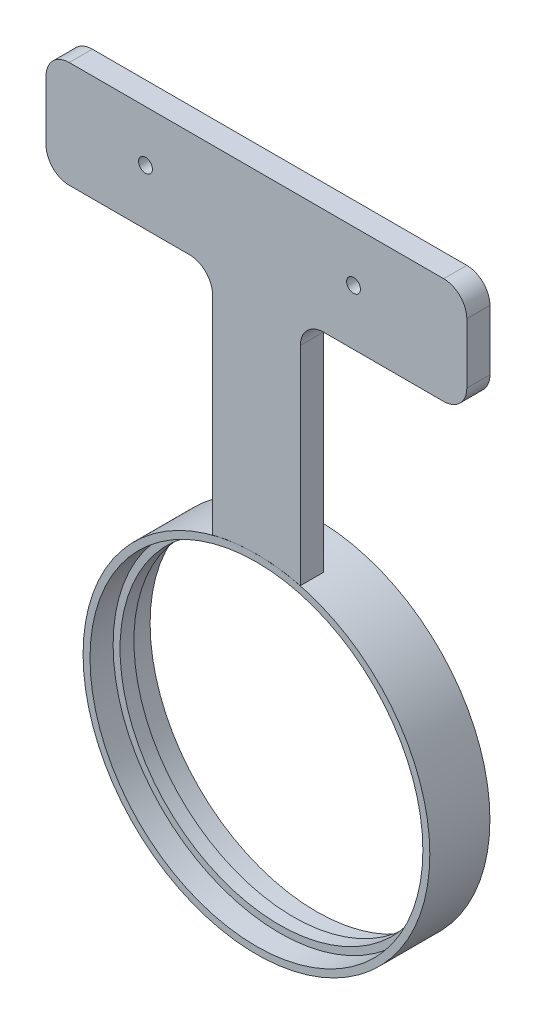
ISO-10303-21;
HEADER;
FILE_DESCRIPTION(('STEP AP214'),'2;1');
FILE_NAME('part.step','',(''),(''),'','','');
FILE_SCHEMA(('AUTOMOTIVE_DESIGN { 1 0 10303 214 1 1 1 1 }'));
ENDSEC;
DATA;
#1=APPLICATION_CONTEXT('core data for automotive mechanical design processes');
#2=APPLICATION_PROTOCOL_DEFINITION('international standard','automotive_design',2000,#1);
#3=PRODUCT_CONTEXT('',#1,'mechanical');
#4=PRODUCT('Part','Part','',(#3));
#5=PRODUCT_RELATED_PRODUCT_CATEGORY('part','',(#4));
#6=PRODUCT_DEFINITION_FORMATION('','',#4);
#7=PRODUCT_DEFINITION_CONTEXT('part definition',#1,'design');
#8=PRODUCT_DEFINITION('design','',#6,#7);
#9=PRODUCT_DEFINITION_SHAPE('','',#8);
#10=(LENGTH_UNIT() NAMED_UNIT(*) SI_UNIT(.MILLI.,.METRE.));
#11=(NAMED_UNIT(*) PLANE_ANGLE_UNIT() SI_UNIT($,.RADIAN.));
#12=(NAMED_UNIT(*) SI_UNIT($,.STERADIAN.) SOLID_ANGLE_UNIT());
#13=UNCERTAINTY_MEASURE_WITH_UNIT(LENGTH_MEASURE(1.E-05),#10,'distance_accuracy_value','');
#14=(GEOMETRIC_REPRESENTATION_CONTEXT(3) GLOBAL_UNCERTAINTY_ASSIGNED_CONTEXT((#13)) GLOBAL_UNIT_ASSIGNED_CONTEXT((#10,
#11,#12)) REPRESENTATION_CONTEXT('',''));
#15=CARTESIAN_POINT('',(0.,0.,0.));
#16=DIRECTION('',(0.,0.,1.));
#17=DIRECTION('',(1.,0.,0.));
#18=AXIS2_PLACEMENT_3D('',#15,#16,#17);
#19=CARTESIAN_POINT('',(45.5,-36.3153777322306,-8.));
#20=DIRECTION('',(0.,0.,1.));
#21=DIRECTION('',(1.,0.,0.));
#22=AXIS2_PLACEMENT_3D('',#19,#20,#21);
#23=CYLINDRICAL_SURFACE('',#22,37.5);
#24=CARTESIAN_POINT('',(45.5,-36.3153777322306,-8.));
#25=DIRECTION('',(0.,0.,1.));
#26=DIRECTION('',(1.,0.,0.));
#27=AXIS2_PLACEMENT_3D('',#24,#25,#26);
#28=CIRCLE('',#27,37.5);
#29=CARTESIAN_POINT('',(83.,-36.3153777322306,-8.));
#30=VERTEX_POINT('',#29);
#31=EDGE_CURVE('E11',#30,#30,#28,.T.);
#32=CARTESIAN_POINT('',(45.5,-36.3153777322306,5.));
#33=DIRECTION('',(0.,0.,1.));
#34=DIRECTION('',(1.,0.,0.));
#35=AXIS2_PLACEMENT_3D('',#32,#33,#34);
#36=CIRCLE('',#35,37.5);
#37=CARTESIAN_POINT('',(83.,-36.3153777322306,5.));
#38=VERTEX_POINT('',#37);
#39=EDGE_CURVE('E60',#38,#38,#36,.T.);
#40=CARTESIAN_POINT('',(83.,-36.3153777322306,-8.));
#41=CARTESIAN_POINT('',(83.,-36.3153777322306,-7.86458333333333));
#42=CARTESIAN_POINT('',(83.,-36.3153777322306,-7.72916666666667));
#43=CARTESIAN_POINT('',(83.,-36.3153777322306,-7.45833333333333));
#44=CARTESIAN_POINT('',(83.,-36.3153777322306,-7.32291666666667));
#45=CARTESIAN_POINT('',(83.,-36.3153777322306,-7.05208333333333));
#46=CARTESIAN_POINT('',(83.,-36.3153777322306,-6.91666666666667));
#47=CARTESIAN_POINT('',(83.,-36.3153777322306,-6.64583333333333));
#48=CARTESIAN_POINT('',(83.,-36.3153777322306,-6.51041666666667));
#49=CARTESIAN_POINT('',(83.,-36.3153777322306,-6.23958333333333));
#50=CARTESIAN_POINT('',(83.,-36.3153777322306,-6.10416666666667));
#51=CARTESIAN_POINT('',(83.,-36.3153777322306,-5.83333333333334));
#52=CARTESIAN_POINT('',(83.,-36.3153777322306,-5.69791666666667));
#53=CARTESIAN_POINT('',(83.,-36.3153777322306,-5.42708333333333));
#54=CARTESIAN_POINT('',(83.,-36.3153777322306,-5.29166666666667));
#55=CARTESIAN_POINT('',(83.,-36.3153777322306,-5.02083333333333));
#56=CARTESIAN_POINT('',(83.,-36.3153777322306,-4.88541666666667));
#57=CARTESIAN_POINT('',(83.,-36.3153777322306,-4.61458333333333));
#58=CARTESIAN_POINT('',(83.,-36.3153777322306,-4.47916666666667));
#59=CARTESIAN_POINT('',(83.,-36.3153777322306,-4.20833333333333));
#60=CARTESIAN_POINT('',(83.,-36.3153777322306,-4.07291666666667));
#61=CARTESIAN_POINT('',(83.,-36.3153777322306,-3.80208333333333));
#62=CARTESIAN_POINT('',(83.,-36.3153777322306,-3.66666666666667));
#63=CARTESIAN_POINT('',(83.,-36.3153777322306,-3.39583333333333));
#64=CARTESIAN_POINT('',(83.,-36.3153777322306,-3.26041666666667));
#65=CARTESIAN_POINT('',(83.,-36.3153777322306,-2.98958333333333));
#66=CARTESIAN_POINT('',(83.,-36.3153777322306,-2.85416666666667));
#67=CARTESIAN_POINT('',(83.,-36.3153777322306,-2.58333333333333));
#68=CARTESIAN_POINT('',(83.,-36.3153777322306,-2.44791666666667));
#69=CARTESIAN_POINT('',(83.,-36.3153777322306,-2.17708333333333));
#70=CARTESIAN_POINT('',(83.,-36.3153777322306,-2.04166666666667));
#71=CARTESIAN_POINT('',(83.,-36.3153777322306,-1.77083333333333));
#72=CARTESIAN_POINT('',(83.,-36.3153777322306,-1.63541666666667));
#73=CARTESIAN_POINT('',(83.,-36.3153777322306,-1.36458333333333));
#74=CARTESIAN_POINT('',(83.,-36.3153777322306,-1.22916666666667));
#75=CARTESIAN_POINT('',(83.,-36.3153777322306,-0.958333333333334));
#76=CARTESIAN_POINT('',(83.,-36.3153777322306,-0.822916666666668));
#77=CARTESIAN_POINT('',(83.,-36.3153777322306,-0.552083333333335));
#78=CARTESIAN_POINT('',(83.,-36.3153777322306,-0.416666666666668));
#79=CARTESIAN_POINT('',(83.,-36.3153777322306,-0.145833333333335));
#80=CARTESIAN_POINT('',(83.,-36.3153777322306,-0.0104166666666681));
#81=CARTESIAN_POINT('',(83.,-36.3153777322306,0.260416666666665));
#82=CARTESIAN_POINT('',(83.,-36.3153777322306,0.395833333333332));
#83=CARTESIAN_POINT('',(83.,-36.3153777322306,0.666666666666665));
#84=CARTESIAN_POINT('',(83.,-36.3153777322306,0.802083333333332));
#85=CARTESIAN_POINT('',(83.,-36.3153777322306,1.07291666666667));
#86=CARTESIAN_POINT('',(83.,-36.3153777322306,1.20833333333333));
#87=CARTESIAN_POINT('',(83.,-36.3153777322306,1.47916666666667));
#88=CARTESIAN_POINT('',(83.,-36.3153777322306,1.61458333333333));
#89=CARTESIAN_POINT('',(83.,-36.3153777322306,1.88541666666667));
#90=CARTESIAN_POINT('',(83.,-36.3153777322306,2.02083333333333));
#91=CARTESIAN_POINT('',(83.,-36.3153777322306,2.29166666666667));
#92=CARTESIAN_POINT('',(83.,-36.3153777322306,2.42708333333333));
#93=CARTESIAN_POINT('',(83.,-36.3153777322306,2.69791666666667));
#94=CARTESIAN_POINT('',(83.,-36.3153777322306,2.83333333333333));
#95=CARTESIAN_POINT('',(83.,-36.3153777322306,3.10416666666667));
#96=CARTESIAN_POINT('',(83.,-36.3153777322306,3.23958333333333));
#97=CARTESIAN_POINT('',(83.,-36.3153777322306,3.51041666666667));
#98=CARTESIAN_POINT('',(83.,-36.3153777322306,3.64583333333333));
#99=CARTESIAN_POINT('',(83.,-36.3153777322306,3.91666666666667));
#100=CARTESIAN_POINT('',(83.,-36.3153777322306,4.05208333333333));
#101=CARTESIAN_POINT('',(83.,-36.3153777322306,4.32291666666667));
#102=CARTESIAN_POINT('',(83.,-36.3153777322306,4.45833333333333));
#103=CARTESIAN_POINT('',(83.,-36.3153777322306,4.72916666666667));
#104=CARTESIAN_POINT('',(83.,-36.3153777322306,4.86458333333333));
#105=CARTESIAN_POINT('',(83.,-36.3153777322306,5.));
#106=B_SPLINE_CURVE_WITH_KNOTS('',3,(#40,#41,#42,#43,#44,#45,#46,#47,#48,#49,#50,#51,#52,#53,
#54,#55,#56,#57,#58,#59,#60,#61,#62,#63,#64,#65,#66,#67,#68,#69,#70,#71,#72,#73,#74,#75,#76,#77,
#78,#79,#80,#81,#82,#83,#84,#85,#86,#87,#88,#89,#90,#91,#92,#93,#94,#95,#96,#97,#98,#99,#100,
#101,#102,#103,#104,#105),.UNSPECIFIED.,.F.,.F.,(4,2,2,2,2,2,2,2,2,2,2,2,2,2,2,2,2,2,2,2,2,2,2,
2,2,2,2,2,2,2,2,2,4),(0.,0.40625,0.812499999999999,1.21875,1.625,2.03125,2.4375,2.84375,3.25,
3.65625,4.0625,4.46875,4.875,5.28125,5.6875,6.09375,6.5,6.90625,7.3125,7.71875,8.125,8.53125,
8.9375,9.34375,9.75,10.15625,10.5625,10.96875,11.375,11.78125,12.1875,12.59375,13.),.UNSPECIFIED.);
#107=EDGE_CURVE('BSEAM53',#30,#38,#106,.T.);
#108=ORIENTED_EDGE('',*,*,#31,.T.);
#109=ORIENTED_EDGE('',*,*,#39,.F.);
#110=ORIENTED_EDGE('',*,*,#107,.T.);
#111=ORIENTED_EDGE('',*,*,#107,.F.);
#112=EDGE_LOOP('',(#108,#110,#109,#111));
#113=FACE_BOUND('',#112,.T.);
#114=ADVANCED_FACE('F53',(#113),#23,.T.);
#115=CARTESIAN_POINT('',(45.5,-36.3153777322306,-8.));
#116=DIRECTION('',(0.,0.,1.));
#117=DIRECTION('',(1.,0.,0.));
#118=AXIS2_PLACEMENT_3D('',#115,#116,#117);
#119=PLANE('',#118);
#120=CARTESIAN_POINT('',(45.5,-36.3153777322306,-8.));
#121=DIRECTION('',(0.,0.,1.));
#122=DIRECTION('',(1.,0.,0.));
#123=AXIS2_PLACEMENT_3D('',#120,#121,#122);
#124=CIRCLE('',#123,36.);
#125=CARTESIAN_POINT('',(81.5,-36.3153777322306,-8.));
#126=VERTEX_POINT('',#125);
#127=EDGE_CURVE('E70',#126,#126,#124,.T.);
#128=ORIENTED_EDGE('',*,*,#127,.T.);
#129=EDGE_LOOP('',(#128));
#130=FACE_BOUND('',#129,.T.);
#131=ORIENTED_EDGE('',*,*,#31,.F.);
#132=EDGE_LOOP('',(#131));
#133=FACE_BOUND('',#132,.T.);
#134=ADVANCED_FACE('F97',(#130,#133),#119,.F.);
#135=CARTESIAN_POINT('',(45.5,-36.3153777322306,5.));
#136=DIRECTION('',(0.,0.,1.));
#137=DIRECTION('',(1.,0.,0.));
#138=AXIS2_PLACEMENT_3D('',#135,#136,#137);
#139=PLANE('',#138);
#140=CARTESIAN_POINT('',(45.5,-36.3153777322306,5.));
#141=DIRECTION('',(0.,0.,1.));
#142=DIRECTION('',(1.,0.,0.));
#143=AXIS2_PLACEMENT_3D('',#140,#141,#142);
#144=CIRCLE('',#143,36.);
#145=CARTESIAN_POINT('',(81.5,-36.3153777322306,5.));
#146=VERTEX_POINT('',#145);
#147=EDGE_CURVE('E67',#146,#146,#144,.T.);
#148=ORIENTED_EDGE('',*,*,#147,.F.);
#149=EDGE_LOOP('',(#148));
#150=FACE_BOUND('',#149,.T.);
#151=ORIENTED_EDGE('',*,*,#39,.T.);
#152=EDGE_LOOP('',(#151));
#153=FACE_BOUND('',#152,.T.);
#154=ADVANCED_FACE('F101',(#150,#153),#139,.T.);
#155=CARTESIAN_POINT('',(45.5,-36.3153777322306,0.));
#156=DIRECTION('',(0.,0.,1.));
#157=DIRECTION('',(1.,0.,0.));
#158=AXIS2_PLACEMENT_3D('',#155,#156,#157);
#159=CYLINDRICAL_SURFACE('',#158,36.);
#160=CARTESIAN_POINT('',(45.5,-36.3153777322306,0.));
#161=DIRECTION('',(0.,0.,1.));
#162=DIRECTION('',(1.,0.,0.));
#163=AXIS2_PLACEMENT_3D('',#160,#161,#162);
#164=CIRCLE('',#163,36.);
#165=CARTESIAN_POINT('',(81.5,-36.3153777322306,0.));
#166=VERTEX_POINT('',#165);
#167=EDGE_CURVE('E65',#166,#166,#164,.T.);
#168=ORIENTED_EDGE('',*,*,#167,.F.);
#169=EDGE_LOOP('',(#168));
#170=FACE_BOUND('',#169,.T.);
#171=ORIENTED_EDGE('',*,*,#147,.T.);
#172=EDGE_LOOP('',(#171));
#173=FACE_BOUND('',#172,.T.);
#174=ADVANCED_FACE('F108',(#170,#173),#159,.F.);
#175=CARTESIAN_POINT('',(45.5,-36.3153777322306,0.));
#176=DIRECTION('',(0.,0.,1.));
#177=DIRECTION('',(1.,0.,0.));
#178=AXIS2_PLACEMENT_3D('',#175,#176,#177);
#179=PLANE('',#178);
#180=CARTESIAN_POINT('',(45.5,-36.3153777322306,0.));
#181=DIRECTION('',(0.,0.,1.));
#182=DIRECTION('',(1.,0.,0.));
#183=AXIS2_PLACEMENT_3D('',#180,#181,#182);
#184=CIRCLE('',#183,34.5);
#185=CARTESIAN_POINT('',(80.,-36.3153777322306,0.));
#186=VERTEX_POINT('',#185);
#187=EDGE_CURVE('E78',#186,#186,#184,.T.);
#188=ORIENTED_EDGE('',*,*,#187,.F.);
#189=EDGE_LOOP('',(#188));
#190=FACE_BOUND('',#189,.T.);
#191=ORIENTED_EDGE('',*,*,#167,.T.);
#192=EDGE_LOOP('',(#191));
#193=FACE_BOUND('',#192,.T.);
#194=ADVANCED_FACE('F113',(#190,#193),#179,.T.);
#195=CARTESIAN_POINT('',(45.5,-36.3153777322306,-8.));
#196=DIRECTION('',(0.,0.,1.));
#197=DIRECTION('',(1.,0.,0.));
#198=AXIS2_PLACEMENT_3D('',#195,#196,#197);
#199=CYLINDRICAL_SURFACE('',#198,36.);
#200=ORIENTED_EDGE('',*,*,#127,.F.);
#201=EDGE_LOOP('',(#200));
#202=FACE_BOUND('',#201,.T.);
#203=CARTESIAN_POINT('',(45.5,-36.3153777322306,-3.));
#204=DIRECTION('',(0.,0.,1.));
#205=DIRECTION('',(1.,0.,0.));
#206=AXIS2_PLACEMENT_3D('',#203,#204,#205);
#207=CIRCLE('',#206,36.);
#208=CARTESIAN_POINT('',(81.5,-36.3153777322306,-3.));
#209=VERTEX_POINT('',#208);
#210=EDGE_CURVE('E73',#209,#209,#207,.T.);
#211=ORIENTED_EDGE('',*,*,#210,.T.);
#212=EDGE_LOOP('',(#211));
#213=FACE_BOUND('',#212,.T.);
#214=ADVANCED_FACE('F94',(#202,#213),#199,.F.);
#215=CARTESIAN_POINT('',(45.5,-36.3153777322306,-3.));
#216=DIRECTION('',(0.,0.,1.));
#217=DIRECTION('',(1.,0.,0.));
#218=AXIS2_PLACEMENT_3D('',#215,#216,#217);
#219=PLANE('',#218);
#220=CARTESIAN_POINT('',(45.5,-36.3153777322306,-3.));
#221=DIRECTION('',(0.,0.,1.));
#222=DIRECTION('',(1.,0.,0.));
#223=AXIS2_PLACEMENT_3D('',#220,#221,#222);
#224=CIRCLE('',#223,34.5);
#225=CARTESIAN_POINT('',(80.,-36.3153777322306,-3.));
#226=VERTEX_POINT('',#225);
#227=EDGE_CURVE('E56',#226,#226,#224,.T.);
#228=ORIENTED_EDGE('',*,*,#227,.T.);
#229=EDGE_LOOP('',(#228));
#230=FACE_BOUND('',#229,.T.);
#231=ORIENTED_EDGE('',*,*,#210,.F.);
#232=EDGE_LOOP('',(#231));
#233=FACE_BOUND('',#232,.T.);
#234=ADVANCED_FACE('F85',(#230,#233),#219,.F.);
#235=CARTESIAN_POINT('',(45.5,-36.3153777322306,-5.));
#236=DIRECTION('',(0.,0.,1.));
#237=DIRECTION('',(1.,0.,0.));
#238=AXIS2_PLACEMENT_3D('',#235,#236,#237);
#239=CYLINDRICAL_SURFACE('',#238,34.5);
#240=ORIENTED_EDGE('',*,*,#187,.T.);
#241=EDGE_LOOP('',(#240));
#242=FACE_BOUND('',#241,.T.);
#243=ORIENTED_EDGE('',*,*,#227,.F.);
#244=EDGE_LOOP('',(#243));
#245=FACE_BOUND('',#244,.T.);
#246=ADVANCED_FACE('F88',(#242,#245),#239,.F.);
#247=CLOSED_SHELL('',(#114,#134,#154,#174,#194,#214,#234,#246));
#248=MANIFOLD_SOLID_BREP('B2',#247);
#249=CARTESIAN_POINT('',(86.,68.,5.));
#250=DIRECTION('',(0.,0.,1.));
#251=DIRECTION('',(1.,0.,0.));
#252=AXIS2_PLACEMENT_3D('',#249,#250,#251);
#253=CYLINDRICAL_SURFACE('',#252,5.);
#254=DIRECTION('',(0.,0.,1.));
#255=VECTOR('',#254,1.);
#256=CARTESIAN_POINT('',(91.,68.,5.));
#257=LINE('',#256,#255);
#258=CARTESIAN_POINT('',(91.,68.,0.));
#259=VERTEX_POINT('',#258);
#260=CARTESIAN_POINT('',(91.,68.,5.));
#261=VERTEX_POINT('',#260);
#262=EDGE_CURVE('E454',#259,#261,#257,.T.);
#263=ORIENTED_EDGE('',*,*,#262,.F.);
#264=CARTESIAN_POINT('',(86.,68.,0.));
#265=DIRECTION('',(0.,0.,-1.));
#266=DIRECTION('',(-1.,0.,0.));
#267=AXIS2_PLACEMENT_3D('',#264,#265,#266);
#268=CIRCLE('',#267,5.);
#269=CARTESIAN_POINT('',(86.,73.,0.));
#270=VERTEX_POINT('',#269);
#271=EDGE_CURVE('E215',#270,#259,#268,.T.);
#272=ORIENTED_EDGE('',*,*,#271,.F.);
#273=DIRECTION('',(0.,0.,1.));
#274=VECTOR('',#273,1.);
#275=CARTESIAN_POINT('',(86.,73.,5.));
#276=LINE('',#275,#274);
#277=CARTESIAN_POINT('',(86.,73.,5.));
#278=VERTEX_POINT('',#277);
#279=EDGE_CURVE('E310',#278,#270,#276,.F.);
#280=ORIENTED_EDGE('',*,*,#279,.F.);
#281=CARTESIAN_POINT('',(86.,68.,5.));
#282=DIRECTION('',(0.,0.,-1.));
#283=DIRECTION('',(-1.,0.,0.));
#284=AXIS2_PLACEMENT_3D('',#281,#282,#283);
#285=CIRCLE('',#284,5.);
#286=EDGE_CURVE('E51',#261,#278,#285,.F.);
#287=ORIENTED_EDGE('',*,*,#286,.F.);
#288=EDGE_LOOP('',(#263,#272,#280,#287));
#289=FACE_BOUND('',#288,.T.);
#290=ADVANCED_FACE('F207',(#289),#253,.T.);
#291=CARTESIAN_POINT('',(0.,0.,5.));
#292=DIRECTION('',(1.,0.,0.));
#293=DIRECTION('',(0.,0.,-1.));
#294=AXIS2_PLACEMENT_3D('',#291,#292,#293);
#295=PLANE('',#294);
#296=DIRECTION('',(0.,0.,1.));
#297=VECTOR('',#296,1.);
#298=CARTESIAN_POINT('',(0.,68.,0.));
#299=LINE('',#298,#297);
#300=CARTESIAN_POINT('',(0.,68.,0.));
#301=VERTEX_POINT('',#300);
#302=CARTESIAN_POINT('',(0.,68.,5.));
#303=VERTEX_POINT('',#302);
#304=EDGE_CURVE('E325',#301,#303,#299,.T.);
#305=ORIENTED_EDGE('',*,*,#304,.F.);
#306=DIRECTION('',(0.,-1.,0.));
#307=VECTOR('',#306,1.);
#308=CARTESIAN_POINT('',(0.,0.,0.));
#309=LINE('',#308,#307);
#310=CARTESIAN_POINT('',(0.,55.,0.));
#311=VERTEX_POINT('',#310);
#312=EDGE_CURVE('E330',#301,#311,#309,.T.);
#313=ORIENTED_EDGE('',*,*,#312,.T.);
#314=DIRECTION('',(0.,0.,1.));
#315=VECTOR('',#314,1.);
#316=CARTESIAN_POINT('',(0.,55.,-5.));
#317=LINE('',#316,#315);
#318=CARTESIAN_POINT('',(0.,55.,5.));
#319=VERTEX_POINT('',#318);
#320=EDGE_CURVE('E366',#311,#319,#317,.T.);
#321=ORIENTED_EDGE('',*,*,#320,.T.);
#322=DIRECTION('',(0.,-1.,0.));
#323=VECTOR('',#322,1.);
#324=CARTESIAN_POINT('',(0.,0.,5.));
#325=LINE('',#324,#323);
#326=EDGE_CURVE('E314',#303,#319,#325,.T.);
#327=ORIENTED_EDGE('',*,*,#326,.F.);
#328=EDGE_LOOP('',(#305,#313,#321,#327));
#329=FACE_BOUND('',#328,.T.);
#330=ADVANCED_FACE('F507',(#329),#295,.F.);
#331=CARTESIAN_POINT('',(0.,0.,5.));
#332=DIRECTION('',(0.,0.,-1.));
#333=DIRECTION('',(-1.,0.,0.));
#334=AXIS2_PLACEMENT_3D('',#331,#332,#333);
#335=PLANE('',#334);
#336=CARTESIAN_POINT('',(21.5,62.,5.));
#337=DIRECTION('',(0.,0.,1.));
#338=DIRECTION('',(1.,0.,0.));
#339=AXIS2_PLACEMENT_3D('',#336,#337,#338);
#340=CIRCLE('',#339,1.5);
#341=CARTESIAN_POINT('',(23.,62.,5.));
#342=VERTEX_POINT('',#341);
#343=EDGE_CURVE('E557',#342,#342,#340,.T.);
#344=ORIENTED_EDGE('',*,*,#343,.F.);
#345=EDGE_LOOP('',(#344));
#346=FACE_BOUND('',#345,.T.);
#347=CARTESIAN_POINT('',(66.5,62.,5.));
#348=DIRECTION('',(0.,0.,1.));
#349=DIRECTION('',(1.,0.,0.));
#350=AXIS2_PLACEMENT_3D('',#347,#348,#349);
#351=CIRCLE('',#350,1.5);
#352=CARTESIAN_POINT('',(68.,62.,5.));
#353=VERTEX_POINT('',#352);
#354=EDGE_CURVE('E559',#353,#353,#351,.T.);
#355=ORIENTED_EDGE('',*,*,#354,.F.);
#356=EDGE_LOOP('',(#355));
#357=FACE_BOUND('',#356,.T.);
#358=DIRECTION('',(0.,1.,0.));
#359=VECTOR('',#358,1.);
#360=CARTESIAN_POINT('',(91.,0.,5.));
#361=LINE('',#360,#359);
#362=CARTESIAN_POINT('',(91.,55.,5.));
#363=VERTEX_POINT('',#362);
#364=EDGE_CURVE('E414',#363,#261,#361,.T.);
#365=ORIENTED_EDGE('',*,*,#364,.T.);
#366=ORIENTED_EDGE('',*,*,#286,.T.);
#367=DIRECTION('',(-1.,0.,0.));
#368=VECTOR('',#367,1.);
#369=CARTESIAN_POINT('',(0.,73.,5.));
#370=LINE('',#369,#368);
#371=CARTESIAN_POINT('',(5.00000000000004,73.,5.));
#372=VERTEX_POINT('',#371);
#373=EDGE_CURVE('E417',#278,#372,#370,.T.);
#374=ORIENTED_EDGE('',*,*,#373,.T.);
#375=CARTESIAN_POINT('',(5.,68.,5.));
#376=DIRECTION('',(0.,0.,1.));
#377=DIRECTION('',(1.,0.,0.));
#378=AXIS2_PLACEMENT_3D('',#375,#376,#377);
#379=CIRCLE('',#378,5.);
#380=EDGE_CURVE('E323',#372,#303,#379,.T.);
#381=ORIENTED_EDGE('',*,*,#380,.T.);
#382=ORIENTED_EDGE('',*,*,#326,.T.);
#383=CARTESIAN_POINT('',(5.,55.,5.));
#384=DIRECTION('',(0.,0.,-1.));
#385=DIRECTION('',(-1.,0.,0.));
#386=AXIS2_PLACEMENT_3D('',#383,#384,#385);
#387=CIRCLE('',#386,5.);
#388=CARTESIAN_POINT('',(5.00000000000004,50.,5.));
#389=VERTEX_POINT('',#388);
#390=EDGE_CURVE('E349',#389,#319,#387,.T.);
#391=ORIENTED_EDGE('',*,*,#390,.F.);
#392=DIRECTION('',(1.,0.,0.));
#393=VECTOR('',#392,1.);
#394=CARTESIAN_POINT('',(5.00000000000004,50.,5.));
#395=LINE('',#394,#393);
#396=CARTESIAN_POINT('',(31.,50.,5.));
#397=VERTEX_POINT('',#396);
#398=EDGE_CURVE('E362',#389,#397,#395,.T.);
#399=ORIENTED_EDGE('',*,*,#398,.T.);
#400=CARTESIAN_POINT('',(31.,45.,5.));
#401=DIRECTION('',(0.,0.,-1.));
#402=DIRECTION('',(-1.,0.,0.));
#403=AXIS2_PLACEMENT_3D('',#400,#401,#402);
#404=CIRCLE('',#403,5.);
#405=CARTESIAN_POINT('',(36.,45.,5.));
#406=VERTEX_POINT('',#405);
#407=EDGE_CURVE('E358',#397,#406,#404,.T.);
#408=ORIENTED_EDGE('',*,*,#407,.T.);
#409=DIRECTION('',(0.,1.,0.));
#410=VECTOR('',#409,1.);
#411=CARTESIAN_POINT('',(36.,0.,5.));
#412=LINE('',#411,#410);
#413=CARTESIAN_POINT('',(36.,0.,5.));
#414=VERTEX_POINT('',#413);
#415=EDGE_CURVE('E353',#414,#406,#412,.T.);
#416=ORIENTED_EDGE('',*,*,#415,.F.);
#417=CARTESIAN_POINT('',(45.5,-37.5,5.));
#418=DIRECTION('',(0.,0.,1.));
#419=DIRECTION('',(-1.,0.,0.));
#420=AXIS2_PLACEMENT_3D('',#417,#418,#419);
#421=CIRCLE('',#420,38.6846222677694);
#422=CARTESIAN_POINT('',(55.,0.,5.));
#423=VERTEX_POINT('',#422);
#424=EDGE_CURVE('E341',#423,#414,#421,.T.);
#425=ORIENTED_EDGE('',*,*,#424,.F.);
#426=DIRECTION('',(0.,1.,0.));
#427=VECTOR('',#426,1.);
#428=CARTESIAN_POINT('',(55.,0.,5.));
#429=LINE('',#428,#427);
#430=CARTESIAN_POINT('',(55.,45.,5.));
#431=VERTEX_POINT('',#430);
#432=EDGE_CURVE('E401',#423,#431,#429,.T.);
#433=ORIENTED_EDGE('',*,*,#432,.T.);
#434=CARTESIAN_POINT('',(60.,45.,5.));
#435=DIRECTION('',(0.,0.,1.));
#436=DIRECTION('',(1.,0.,0.));
#437=AXIS2_PLACEMENT_3D('',#434,#435,#436);
#438=CIRCLE('',#437,5.);
#439=CARTESIAN_POINT('',(60.,50.,5.));
#440=VERTEX_POINT('',#439);
#441=EDGE_CURVE('E405',#440,#431,#438,.T.);
#442=ORIENTED_EDGE('',*,*,#441,.F.);
#443=DIRECTION('',(-1.,0.,0.));
#444=VECTOR('',#443,1.);
#445=CARTESIAN_POINT('',(86.,50.,5.));
#446=LINE('',#445,#444);
#447=CARTESIAN_POINT('',(86.,50.,5.));
#448=VERTEX_POINT('',#447);
#449=EDGE_CURVE('E354',#448,#440,#446,.T.);
#450=ORIENTED_EDGE('',*,*,#449,.F.);
#451=CARTESIAN_POINT('',(86.,55.,5.));
#452=DIRECTION('',(0.,0.,1.));
#453=DIRECTION('',(1.,0.,0.));
#454=AXIS2_PLACEMENT_3D('',#451,#452,#453);
#455=CIRCLE('',#454,4.99999999999999);
#456=EDGE_CURVE('E386',#448,#363,#455,.T.);
#457=ORIENTED_EDGE('',*,*,#456,.T.);
#458=EDGE_LOOP('',(#365,#366,#374,#381,#382,#391,#399,#408,#416,#425,#433,#442,#450,#457));
#459=FACE_BOUND('',#458,.T.);
#460=ADVANCED_FACE('F470',(#346,#357,#459),#335,.F.);
#461=CARTESIAN_POINT('',(0.,0.,0.));
#462=DIRECTION('',(0.,0.,-1.));
#463=DIRECTION('',(-1.,0.,0.));
#464=AXIS2_PLACEMENT_3D('',#461,#462,#463);
#465=PLANE('',#464);
#466=CARTESIAN_POINT('',(21.5,62.,0.));
#467=DIRECTION('',(0.,0.,1.));
#468=DIRECTION('',(1.,0.,0.));
#469=AXIS2_PLACEMENT_3D('',#466,#467,#468);
#470=CIRCLE('',#469,1.5);
#471=CARTESIAN_POINT('',(23.,62.,0.));
#472=VERTEX_POINT('',#471);
#473=EDGE_CURVE('E334',#472,#472,#470,.T.);
#474=ORIENTED_EDGE('',*,*,#473,.T.);
#475=EDGE_LOOP('',(#474));
#476=FACE_BOUND('',#475,.T.);
#477=CARTESIAN_POINT('',(66.5,62.,0.));
#478=DIRECTION('',(0.,0.,1.));
#479=DIRECTION('',(1.,0.,0.));
#480=AXIS2_PLACEMENT_3D('',#477,#478,#479);
#481=CIRCLE('',#480,1.5);
#482=CARTESIAN_POINT('',(68.,62.,0.));
#483=VERTEX_POINT('',#482);
#484=EDGE_CURVE('E337',#483,#483,#481,.T.);
#485=ORIENTED_EDGE('',*,*,#484,.T.);
#486=EDGE_LOOP('',(#485));
#487=FACE_BOUND('',#486,.T.);
#488=DIRECTION('',(-1.,0.,0.));
#489=VECTOR('',#488,1.);
#490=CARTESIAN_POINT('',(0.,73.,0.));
#491=LINE('',#490,#489);
#492=CARTESIAN_POINT('',(5.00000000000004,73.,0.));
#493=VERTEX_POINT('',#492);
#494=EDGE_CURVE('E305',#270,#493,#491,.T.);
#495=ORIENTED_EDGE('',*,*,#494,.F.);
#496=ORIENTED_EDGE('',*,*,#271,.T.);
#497=DIRECTION('',(0.,1.,0.));
#498=VECTOR('',#497,1.);
#499=CARTESIAN_POINT('',(91.,0.,0.));
#500=LINE('',#499,#498);
#501=CARTESIAN_POINT('',(91.,55.,0.));
#502=VERTEX_POINT('',#501);
#503=EDGE_CURVE('E315',#502,#259,#500,.T.);
#504=ORIENTED_EDGE('',*,*,#503,.F.);
#505=CARTESIAN_POINT('',(86.,55.,0.));
#506=DIRECTION('',(0.,0.,-1.));
#507=DIRECTION('',(-1.,0.,0.));
#508=AXIS2_PLACEMENT_3D('',#505,#506,#507);
#509=CIRCLE('',#508,4.99999999999999);
#510=CARTESIAN_POINT('',(86.,50.,0.));
#511=VERTEX_POINT('',#510);
#512=EDGE_CURVE('E435',#502,#511,#509,.T.);
#513=ORIENTED_EDGE('',*,*,#512,.T.);
#514=DIRECTION('',(1.,0.,0.));
#515=VECTOR('',#514,1.);
#516=CARTESIAN_POINT('',(0.,50.,0.));
#517=LINE('',#516,#515);
#518=CARTESIAN_POINT('',(60.,50.,0.));
#519=VERTEX_POINT('',#518);
#520=EDGE_CURVE('E432',#519,#511,#517,.T.);
#521=ORIENTED_EDGE('',*,*,#520,.F.);
#522=CARTESIAN_POINT('',(60.,45.,0.));
#523=DIRECTION('',(0.,0.,-1.));
#524=DIRECTION('',(-1.,0.,0.));
#525=AXIS2_PLACEMENT_3D('',#522,#523,#524);
#526=CIRCLE('',#525,5.);
#527=CARTESIAN_POINT('',(55.,45.,0.));
#528=VERTEX_POINT('',#527);
#529=EDGE_CURVE('E420',#528,#519,#526,.T.);
#530=ORIENTED_EDGE('',*,*,#529,.F.);
#531=DIRECTION('',(0.,-1.,0.));
#532=VECTOR('',#531,1.);
#533=CARTESIAN_POINT('',(55.,0.,0.));
#534=LINE('',#533,#532);
#535=CARTESIAN_POINT('',(55.,0.,0.));
#536=VERTEX_POINT('',#535);
#537=EDGE_CURVE('E428',#528,#536,#534,.T.);
#538=ORIENTED_EDGE('',*,*,#537,.T.);
#539=CARTESIAN_POINT('',(45.5,-37.5,0.));
#540=DIRECTION('',(0.,0.,-1.));
#541=DIRECTION('',(-1.,0.,0.));
#542=AXIS2_PLACEMENT_3D('',#539,#540,#541);
#543=CIRCLE('',#542,38.6846222677694);
#544=CARTESIAN_POINT('',(36.,0.,0.));
#545=VERTEX_POINT('',#544);
#546=EDGE_CURVE('E345',#545,#536,#543,.T.);
#547=ORIENTED_EDGE('',*,*,#546,.F.);
#548=DIRECTION('',(0.,-1.,0.));
#549=VECTOR('',#548,1.);
#550=CARTESIAN_POINT('',(36.,0.,0.));
#551=LINE('',#550,#549);
#552=CARTESIAN_POINT('',(36.,45.,0.));
#553=VERTEX_POINT('',#552);
#554=EDGE_CURVE('E439',#553,#545,#551,.T.);
#555=ORIENTED_EDGE('',*,*,#554,.F.);
#556=CARTESIAN_POINT('',(31.,45.,0.));
#557=DIRECTION('',(0.,0.,-1.));
#558=DIRECTION('',(-1.,0.,0.));
#559=AXIS2_PLACEMENT_3D('',#556,#557,#558);
#560=CIRCLE('',#559,5.);
#561=CARTESIAN_POINT('',(31.,50.,0.));
#562=VERTEX_POINT('',#561);
#563=EDGE_CURVE('E443',#553,#562,#560,.F.);
#564=ORIENTED_EDGE('',*,*,#563,.T.);
#565=DIRECTION('',(-1.,0.,0.));
#566=VECTOR('',#565,1.);
#567=CARTESIAN_POINT('',(0.,50.,0.));
#568=LINE('',#567,#566);
#569=CARTESIAN_POINT('',(5.00000000000004,50.,0.));
#570=VERTEX_POINT('',#569);
#571=EDGE_CURVE('E447',#562,#570,#568,.T.);
#572=ORIENTED_EDGE('',*,*,#571,.T.);
#573=CARTESIAN_POINT('',(5.,55.,0.));
#574=DIRECTION('',(0.,0.,-1.));
#575=DIRECTION('',(-1.,0.,0.));
#576=AXIS2_PLACEMENT_3D('',#573,#574,#575);
#577=CIRCLE('',#576,5.);
#578=EDGE_CURVE('E451',#311,#570,#577,.F.);
#579=ORIENTED_EDGE('',*,*,#578,.F.);
#580=ORIENTED_EDGE('',*,*,#312,.F.);
#581=CARTESIAN_POINT('',(5.,68.,0.));
#582=DIRECTION('',(0.,0.,1.));
#583=DIRECTION('',(1.,0.,0.));
#584=AXIS2_PLACEMENT_3D('',#581,#582,#583);
#585=CIRCLE('',#584,5.);
#586=EDGE_CURVE('E320',#493,#301,#585,.T.);
#587=ORIENTED_EDGE('',*,*,#586,.F.);
#588=EDGE_LOOP('',(#495,#496,#504,#513,#521,#530,#538,#547,#555,#564,#572,#579,#580,#587));
#589=FACE_BOUND('',#588,.T.);
#590=ADVANCED_FACE('F328',(#476,#487,#589),#465,.T.);
#591=CARTESIAN_POINT('',(91.,0.,5.));
#592=DIRECTION('',(-1.,0.,0.));
#593=DIRECTION('',(0.,0.,1.));
#594=AXIS2_PLACEMENT_3D('',#591,#592,#593);
#595=PLANE('',#594);
#596=ORIENTED_EDGE('',*,*,#503,.T.);
#597=ORIENTED_EDGE('',*,*,#262,.T.);
#598=ORIENTED_EDGE('',*,*,#364,.F.);
#599=DIRECTION('',(0.,0.,1.));
#600=VECTOR('',#599,1.);
#601=CARTESIAN_POINT('',(91.,55.,-5.));
#602=LINE('',#601,#600);
#603=EDGE_CURVE('E393',#502,#363,#602,.T.);
#604=ORIENTED_EDGE('',*,*,#603,.F.);
#605=EDGE_LOOP('',(#596,#597,#598,#604));
#606=FACE_BOUND('',#605,.T.);
#607=ADVANCED_FACE('F464',(#606),#595,.F.);
#608=CARTESIAN_POINT('',(0.,73.,5.));
#609=DIRECTION('',(0.,-1.,0.));
#610=DIRECTION('',(0.,0.,-1.));
#611=AXIS2_PLACEMENT_3D('',#608,#609,#610);
#612=PLANE('',#611);
#613=ORIENTED_EDGE('',*,*,#373,.F.);
#614=ORIENTED_EDGE('',*,*,#279,.T.);
#615=ORIENTED_EDGE('',*,*,#494,.T.);
#616=DIRECTION('',(0.,0.,1.));
#617=VECTOR('',#616,1.);
#618=CARTESIAN_POINT('',(5.00000000000004,73.,0.));
#619=LINE('',#618,#617);
#620=EDGE_CURVE('E309',#493,#372,#619,.T.);
#621=ORIENTED_EDGE('',*,*,#620,.T.);
#622=EDGE_LOOP('',(#613,#614,#615,#621));
#623=FACE_BOUND('',#622,.T.);
#624=ADVANCED_FACE('F308',(#623),#612,.F.);
#625=CARTESIAN_POINT('',(86.,50.,-5.));
#626=DIRECTION('',(0.,1.,0.));
#627=DIRECTION('',(0.,0.,1.));
#628=AXIS2_PLACEMENT_3D('',#625,#626,#627);
#629=PLANE('',#628);
#630=ORIENTED_EDGE('',*,*,#520,.T.);
#631=DIRECTION('',(0.,0.,1.));
#632=VECTOR('',#631,1.);
#633=CARTESIAN_POINT('',(86.,50.,-5.));
#634=LINE('',#633,#632);
#635=EDGE_CURVE('E348',#511,#448,#634,.T.);
#636=ORIENTED_EDGE('',*,*,#635,.T.);
#637=ORIENTED_EDGE('',*,*,#449,.T.);
#638=DIRECTION('',(0.,0.,1.));
#639=VECTOR('',#638,1.);
#640=CARTESIAN_POINT('',(60.,50.,-5.));
#641=LINE('',#640,#639);
#642=EDGE_CURVE('E383',#519,#440,#641,.T.);
#643=ORIENTED_EDGE('',*,*,#642,.F.);
#644=EDGE_LOOP('',(#630,#636,#637,#643));
#645=FACE_BOUND('',#644,.T.);
#646=ADVANCED_FACE('F474',(#645),#629,.F.);
#647=CARTESIAN_POINT('',(86.,55.,-5.));
#648=DIRECTION('',(0.,0.,1.));
#649=DIRECTION('',(1.,0.,0.));
#650=AXIS2_PLACEMENT_3D('',#647,#648,#649);
#651=CYLINDRICAL_SURFACE('',#650,4.99999999999999);
#652=ORIENTED_EDGE('',*,*,#603,.T.);
#653=ORIENTED_EDGE('',*,*,#456,.F.);
#654=ORIENTED_EDGE('',*,*,#635,.F.);
#655=ORIENTED_EDGE('',*,*,#512,.F.);
#656=EDGE_LOOP('',(#652,#653,#654,#655));
#657=FACE_BOUND('',#656,.T.);
#658=ADVANCED_FACE('F467',(#657),#651,.T.);
#659=CARTESIAN_POINT('',(55.,0.,-5.));
#660=DIRECTION('',(1.,0.,0.));
#661=DIRECTION('',(0.,0.,-1.));
#662=AXIS2_PLACEMENT_3D('',#659,#660,#661);
#663=PLANE('',#662);
#664=DIRECTION('',(0.,0.,1.));
#665=VECTOR('',#664,1.);
#666=CARTESIAN_POINT('',(55.,45.,-5.));
#667=LINE('',#666,#665);
#668=EDGE_CURVE('E387',#528,#431,#667,.T.);
#669=ORIENTED_EDGE('',*,*,#668,.T.);
#670=ORIENTED_EDGE('',*,*,#432,.F.);
#671=DIRECTION('',(0.,0.,1.));
#672=VECTOR('',#671,1.);
#673=CARTESIAN_POINT('',(55.,0.,-5.));
#674=LINE('',#673,#672);
#675=EDGE_CURVE('E390',#536,#423,#674,.T.);
#676=ORIENTED_EDGE('',*,*,#675,.F.);
#677=ORIENTED_EDGE('',*,*,#537,.F.);
#678=EDGE_LOOP('',(#669,#670,#676,#677));
#679=FACE_BOUND('',#678,.T.);
#680=ADVANCED_FACE('F484',(#679),#663,.T.);
#681=CARTESIAN_POINT('',(60.,45.,-5.));
#682=DIRECTION('',(0.,0.,1.));
#683=DIRECTION('',(1.,0.,0.));
#684=AXIS2_PLACEMENT_3D('',#681,#682,#683);
#685=CYLINDRICAL_SURFACE('',#684,5.);
#686=ORIENTED_EDGE('',*,*,#529,.T.);
#687=ORIENTED_EDGE('',*,*,#642,.T.);
#688=ORIENTED_EDGE('',*,*,#441,.T.);
#689=ORIENTED_EDGE('',*,*,#668,.F.);
#690=EDGE_LOOP('',(#686,#687,#688,#689));
#691=FACE_BOUND('',#690,.T.);
#692=ADVANCED_FACE('F480',(#691),#685,.F.);
#693=CARTESIAN_POINT('',(5.,55.,-5.));
#694=DIRECTION('',(0.,0.,1.));
#695=DIRECTION('',(1.,0.,0.));
#696=AXIS2_PLACEMENT_3D('',#693,#694,#695);
#697=CYLINDRICAL_SURFACE('',#696,5.);
#698=ORIENTED_EDGE('',*,*,#578,.T.);
#699=DIRECTION('',(0.,0.,1.));
#700=VECTOR('',#699,1.);
#701=CARTESIAN_POINT('',(5.00000000000004,50.,-5.));
#702=LINE('',#701,#700);
#703=EDGE_CURVE('E367',#570,#389,#702,.T.);
#704=ORIENTED_EDGE('',*,*,#703,.T.);
#705=ORIENTED_EDGE('',*,*,#390,.T.);
#706=ORIENTED_EDGE('',*,*,#320,.F.);
#707=EDGE_LOOP('',(#698,#704,#705,#706));
#708=FACE_BOUND('',#707,.T.);
#709=ADVANCED_FACE('F503',(#708),#697,.T.);
#710=CARTESIAN_POINT('',(5.00000000000004,50.,-5.));
#711=DIRECTION('',(0.,-1.,0.));
#712=DIRECTION('',(0.,0.,-1.));
#713=AXIS2_PLACEMENT_3D('',#710,#711,#712);
#714=PLANE('',#713);
#715=DIRECTION('',(0.,0.,1.));
#716=VECTOR('',#715,1.);
#717=CARTESIAN_POINT('',(31.,50.,-5.));
#718=LINE('',#717,#716);
#719=EDGE_CURVE('E370',#562,#397,#718,.T.);
#720=ORIENTED_EDGE('',*,*,#719,.T.);
#721=ORIENTED_EDGE('',*,*,#398,.F.);
#722=ORIENTED_EDGE('',*,*,#703,.F.);
#723=ORIENTED_EDGE('',*,*,#571,.F.);
#724=EDGE_LOOP('',(#720,#721,#722,#723));
#725=FACE_BOUND('',#724,.T.);
#726=ADVANCED_FACE('F499',(#725),#714,.T.);
#727=CARTESIAN_POINT('',(31.,45.,-5.));
#728=DIRECTION('',(0.,0.,1.));
#729=DIRECTION('',(1.,0.,0.));
#730=AXIS2_PLACEMENT_3D('',#727,#728,#729);
#731=CYLINDRICAL_SURFACE('',#730,5.);
#732=DIRECTION('',(0.,0.,1.));
#733=VECTOR('',#732,1.);
#734=CARTESIAN_POINT('',(36.,45.,-5.));
#735=LINE('',#734,#733);
#736=EDGE_CURVE('E373',#553,#406,#735,.T.);
#737=ORIENTED_EDGE('',*,*,#736,.T.);
#738=ORIENTED_EDGE('',*,*,#407,.F.);
#739=ORIENTED_EDGE('',*,*,#719,.F.);
#740=ORIENTED_EDGE('',*,*,#563,.F.);
#741=EDGE_LOOP('',(#737,#738,#739,#740));
#742=FACE_BOUND('',#741,.T.);
#743=ADVANCED_FACE('F496',(#742),#731,.F.);
#744=CARTESIAN_POINT('',(36.,0.,-5.));
#745=DIRECTION('',(1.,0.,0.));
#746=DIRECTION('',(0.,0.,-1.));
#747=AXIS2_PLACEMENT_3D('',#744,#745,#746);
#748=PLANE('',#747);
#749=ORIENTED_EDGE('',*,*,#554,.T.);
#750=DIRECTION('',(0.,0.,1.));
#751=VECTOR('',#750,1.);
#752=CARTESIAN_POINT('',(36.,0.,-5.));
#753=LINE('',#752,#751);
#754=EDGE_CURVE('E376',#545,#414,#753,.T.);
#755=ORIENTED_EDGE('',*,*,#754,.T.);
#756=ORIENTED_EDGE('',*,*,#415,.T.);
#757=ORIENTED_EDGE('',*,*,#736,.F.);
#758=EDGE_LOOP('',(#749,#755,#756,#757));
#759=FACE_BOUND('',#758,.T.);
#760=ADVANCED_FACE('F491',(#759),#748,.F.);
#761=CARTESIAN_POINT('',(45.5,-37.5,-5.));
#762=DIRECTION('',(0.,0.,1.));
#763=DIRECTION('',(1.,0.,0.));
#764=AXIS2_PLACEMENT_3D('',#761,#762,#763);
#765=CYLINDRICAL_SURFACE('',#764,38.6846222677694);
#766=ORIENTED_EDGE('',*,*,#546,.T.);
#767=ORIENTED_EDGE('',*,*,#675,.T.);
#768=ORIENTED_EDGE('',*,*,#424,.T.);
#769=ORIENTED_EDGE('',*,*,#754,.F.);
#770=EDGE_LOOP('',(#766,#767,#768,#769));
#771=FACE_BOUND('',#770,.T.);
#772=ADVANCED_FACE('F487',(#771),#765,.F.);
#773=CARTESIAN_POINT('',(5.,68.,0.));
#774=DIRECTION('',(0.,0.,1.));
#775=DIRECTION('',(1.,0.,0.));
#776=AXIS2_PLACEMENT_3D('',#773,#774,#775);
#777=CYLINDRICAL_SURFACE('',#776,5.);
#778=ORIENTED_EDGE('',*,*,#380,.F.);
#779=ORIENTED_EDGE('',*,*,#620,.F.);
#780=ORIENTED_EDGE('',*,*,#586,.T.);
#781=ORIENTED_EDGE('',*,*,#304,.T.);
#782=EDGE_LOOP('',(#778,#779,#780,#781));
#783=FACE_BOUND('',#782,.T.);
#784=ADVANCED_FACE('F319',(#783),#777,.T.);
#785=CARTESIAN_POINT('',(66.5,62.,0.));
#786=DIRECTION('',(0.,0.,1.));
#787=DIRECTION('',(1.,0.,0.));
#788=AXIS2_PLACEMENT_3D('',#785,#786,#787);
#789=CYLINDRICAL_SURFACE('',#788,1.5);
#790=ORIENTED_EDGE('',*,*,#484,.F.);
#791=EDGE_LOOP('',(#790));
#792=FACE_BOUND('',#791,.T.);
#793=ORIENTED_EDGE('',*,*,#354,.T.);
#794=EDGE_LOOP('',(#793));
#795=FACE_BOUND('',#794,.T.);
#796=ADVANCED_FACE('F543',(#792,#795),#789,.F.);
#797=CARTESIAN_POINT('',(21.5,62.,0.));
#798=DIRECTION('',(0.,0.,1.));
#799=DIRECTION('',(1.,0.,0.));
#800=AXIS2_PLACEMENT_3D('',#797,#798,#799);
#801=CYLINDRICAL_SURFACE('',#800,1.5);
#802=ORIENTED_EDGE('',*,*,#473,.F.);
#803=EDGE_LOOP('',(#802));
#804=FACE_BOUND('',#803,.T.);
#805=ORIENTED_EDGE('',*,*,#343,.T.);
#806=EDGE_LOOP('',(#805));
#807=FACE_BOUND('',#806,.T.);
#808=ADVANCED_FACE('F546',(#804,#807),#801,.F.);
#809=CLOSED_SHELL('',(#290,#330,#460,#590,#607,#624,#646,#658,#680,#692,#709,#726,#743,#760,
#772,#784,#796,#808));
#810=MANIFOLD_SOLID_BREP('B6',#809);
#811=ADVANCED_BREP_SHAPE_REPRESENTATION('',(#18,#248,#810),#14);
#812=SHAPE_DEFINITION_REPRESENTATION(#9,#811);
ENDSEC;
END-ISO-10303-21;
